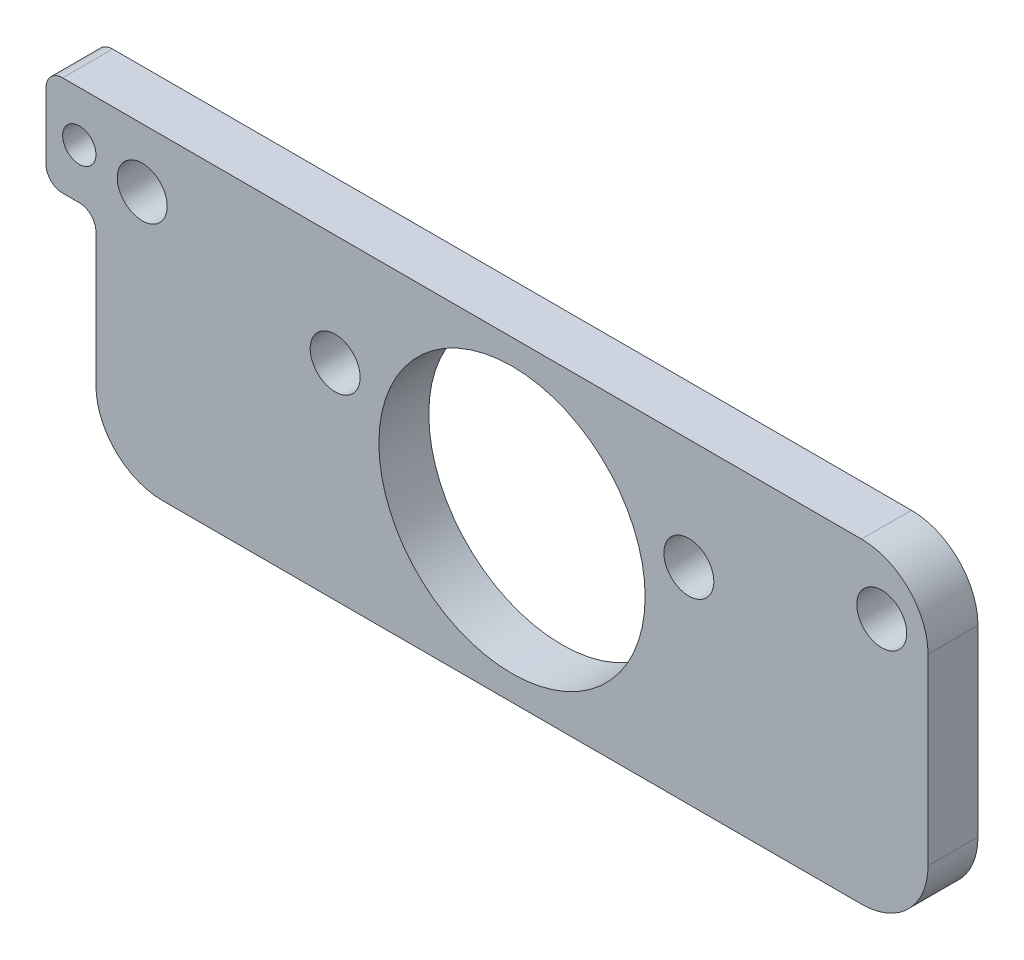
ISO-10303-21;
HEADER;
FILE_DESCRIPTION(('STEP AP214'),'2;1');
FILE_NAME('part.step','',(''),(''),'','','');
FILE_SCHEMA(('AUTOMOTIVE_DESIGN { 1 0 10303 214 1 1 1 1 }'));
ENDSEC;
DATA;
#1=APPLICATION_CONTEXT('core data for automotive mechanical design processes');
#2=APPLICATION_PROTOCOL_DEFINITION('international standard','automotive_design',2000,#1);
#3=PRODUCT_CONTEXT('',#1,'mechanical');
#4=PRODUCT('Part','Part','',(#3));
#5=PRODUCT_RELATED_PRODUCT_CATEGORY('part','',(#4));
#6=PRODUCT_DEFINITION_FORMATION('','',#4);
#7=PRODUCT_DEFINITION_CONTEXT('part definition',#1,'design');
#8=PRODUCT_DEFINITION('design','',#6,#7);
#9=PRODUCT_DEFINITION_SHAPE('','',#8);
#10=(LENGTH_UNIT() NAMED_UNIT(*) SI_UNIT(.MILLI.,.METRE.));
#11=(NAMED_UNIT(*) PLANE_ANGLE_UNIT() SI_UNIT($,.RADIAN.));
#12=(NAMED_UNIT(*) SI_UNIT($,.STERADIAN.) SOLID_ANGLE_UNIT());
#13=UNCERTAINTY_MEASURE_WITH_UNIT(LENGTH_MEASURE(1.E-05),#10,'distance_accuracy_value','');
#14=(GEOMETRIC_REPRESENTATION_CONTEXT(3) GLOBAL_UNCERTAINTY_ASSIGNED_CONTEXT((#13)) GLOBAL_UNIT_ASSIGNED_CONTEXT((#10,
#11,#12)) REPRESENTATION_CONTEXT('',''));
#15=CARTESIAN_POINT('',(0.,0.,0.));
#16=DIRECTION('',(0.,0.,1.));
#17=DIRECTION('',(1.,0.,0.));
#18=AXIS2_PLACEMENT_3D('',#15,#16,#17);
#19=CARTESIAN_POINT('',(-27.0263343656626,1.65967439407026,3.));
#20=DIRECTION('',(0.,0.,1.));
#21=DIRECTION('',(1.,0.,0.));
#22=AXIS2_PLACEMENT_3D('',#19,#20,#21);
#23=PLANE('',#22);
#24=CARTESIAN_POINT('',(21.189959638986,5.11251243142833,3.));
#25=DIRECTION('',(0.,0.,1.));
#26=DIRECTION('',(-1.,0.,0.));
#27=AXIS2_PLACEMENT_3D('',#24,#25,#26);
#28=CIRCLE('',#27,1.5);
#29=CARTESIAN_POINT('',(19.689959638986,5.11251243142833,3.));
#30=VERTEX_POINT('',#29);
#31=EDGE_CURVE('E298',#30,#30,#28,.T.);
#32=ORIENTED_EDGE('',*,*,#31,.F.);
#33=EDGE_LOOP('',(#32));
#34=FACE_BOUND('',#33,.T.);
#35=CARTESIAN_POINT('',(-11.6515184548423,2.00668389019803,3.));
#36=DIRECTION('',(0.,0.,1.));
#37=DIRECTION('',(1.,0.,0.));
#38=AXIS2_PLACEMENT_3D('',#35,#36,#37);
#39=CIRCLE('',#38,1.5);
#40=CARTESIAN_POINT('',(-10.1515184548423,2.00668389019803,3.));
#41=VERTEX_POINT('',#40);
#42=EDGE_CURVE('E310',#41,#41,#39,.T.);
#43=ORIENTED_EDGE('',*,*,#42,.F.);
#44=EDGE_LOOP('',(#43));
#45=FACE_BOUND('',#44,.T.);
#46=CARTESIAN_POINT('',(-1.02633436566255,-0.840325605929738,3.));
#47=DIRECTION('',(0.,0.,1.));
#48=DIRECTION('',(1.,0.,0.));
#49=AXIS2_PLACEMENT_3D('',#46,#47,#48);
#50=CIRCLE('',#49,8.);
#51=CARTESIAN_POINT('',(6.97366563433745,-0.840325605929738,3.));
#52=VERTEX_POINT('',#51);
#53=EDGE_CURVE('E157',#52,#52,#50,.T.);
#54=ORIENTED_EDGE('',*,*,#53,.F.);
#55=EDGE_LOOP('',(#54));
#56=FACE_BOUND('',#55,.T.);
#57=CARTESIAN_POINT('',(-27.0263343656626,1.65967439407026,3.));
#58=DIRECTION('',(0.,0.,-1.));
#59=DIRECTION('',(1.,0.,0.));
#60=AXIS2_PLACEMENT_3D('',#57,#58,#59);
#61=CIRCLE('',#60,0.999999999999999);
#62=CARTESIAN_POINT('',(-27.0263343656626,2.65967439407027,3.));
#63=VERTEX_POINT('',#62);
#64=CARTESIAN_POINT('',(-26.0263343656626,1.65967439407026,3.));
#65=VERTEX_POINT('',#64);
#66=EDGE_CURVE('E177',#63,#65,#61,.T.);
#67=ORIENTED_EDGE('',*,*,#66,.T.);
#68=DIRECTION('',(0.,-1.,0.));
#69=VECTOR('',#68,1.);
#70=CARTESIAN_POINT('',(-26.0263343656626,-6.34032560592973,3.));
#71=LINE('',#70,#69);
#72=CARTESIAN_POINT('',(-26.0263343656626,-6.34032560592973,3.));
#73=VERTEX_POINT('',#72);
#74=EDGE_CURVE('E104',#65,#73,#71,.T.);
#75=ORIENTED_EDGE('',*,*,#74,.T.);
#76=CARTESIAN_POINT('',(-22.0263343656626,-6.34032560592973,3.));
#77=DIRECTION('',(0.,0.,1.));
#78=DIRECTION('',(-1.,0.,0.));
#79=AXIS2_PLACEMENT_3D('',#76,#77,#78);
#80=CIRCLE('',#79,4.);
#81=CARTESIAN_POINT('',(-22.0263343656626,-10.3403256059297,3.));
#82=VERTEX_POINT('',#81);
#83=EDGE_CURVE('E204',#73,#82,#80,.T.);
#84=ORIENTED_EDGE('',*,*,#83,.T.);
#85=DIRECTION('',(1.,0.,0.));
#86=VECTOR('',#85,1.);
#87=CARTESIAN_POINT('',(-22.0263343656626,-10.3403256059297,3.));
#88=LINE('',#87,#86);
#89=CARTESIAN_POINT('',(19.9736656343374,-10.3403256059297,3.));
#90=VERTEX_POINT('',#89);
#91=EDGE_CURVE('E223',#82,#90,#88,.T.);
#92=ORIENTED_EDGE('',*,*,#91,.T.);
#93=CARTESIAN_POINT('',(19.9736656343374,-6.34032560592973,3.));
#94=DIRECTION('',(0.,0.,1.));
#95=DIRECTION('',(1.,0.,0.));
#96=AXIS2_PLACEMENT_3D('',#93,#94,#95);
#97=CIRCLE('',#96,4.);
#98=CARTESIAN_POINT('',(23.9736656343375,-6.34032560592973,3.));
#99=VERTEX_POINT('',#98);
#100=EDGE_CURVE('E220',#90,#99,#97,.T.);
#101=ORIENTED_EDGE('',*,*,#100,.T.);
#102=DIRECTION('',(0.,1.,0.));
#103=VECTOR('',#102,1.);
#104=CARTESIAN_POINT('',(23.9736656343375,4.65967439407026,3.));
#105=LINE('',#104,#103);
#106=CARTESIAN_POINT('',(23.9736656343375,4.65967439407026,3.));
#107=VERTEX_POINT('',#106);
#108=EDGE_CURVE('E222',#99,#107,#105,.T.);
#109=ORIENTED_EDGE('',*,*,#108,.T.);
#110=CARTESIAN_POINT('',(19.9736656343374,4.65967439407026,3.));
#111=DIRECTION('',(0.,0.,1.));
#112=DIRECTION('',(-1.,0.,0.));
#113=AXIS2_PLACEMENT_3D('',#110,#111,#112);
#114=CIRCLE('',#113,4.);
#115=CARTESIAN_POINT('',(19.9736656343374,8.65967439407026,3.));
#116=VERTEX_POINT('',#115);
#117=EDGE_CURVE('E225',#107,#116,#114,.T.);
#118=ORIENTED_EDGE('',*,*,#117,.T.);
#119=DIRECTION('',(-1.,0.,0.));
#120=VECTOR('',#119,1.);
#121=CARTESIAN_POINT('',(-22.0263343656625,8.65967439407026,3.));
#122=LINE('',#121,#120);
#123=CARTESIAN_POINT('',(-28.0263343656625,8.65967439407027,3.));
#124=VERTEX_POINT('',#123);
#125=EDGE_CURVE('E231',#116,#124,#122,.T.);
#126=ORIENTED_EDGE('',*,*,#125,.T.);
#127=CARTESIAN_POINT('',(-28.0263343656625,7.65967439407026,3.));
#128=DIRECTION('',(0.,0.,1.));
#129=DIRECTION('',(1.,0.,0.));
#130=AXIS2_PLACEMENT_3D('',#127,#128,#129);
#131=CIRCLE('',#130,1.);
#132=CARTESIAN_POINT('',(-29.0263343656625,7.65967439407026,3.));
#133=VERTEX_POINT('',#132);
#134=EDGE_CURVE('E135',#124,#133,#131,.T.);
#135=ORIENTED_EDGE('',*,*,#134,.T.);
#136=DIRECTION('',(0.,-1.,0.));
#137=VECTOR('',#136,1.);
#138=CARTESIAN_POINT('',(-29.0263343656625,7.65967439407026,3.));
#139=LINE('',#138,#137);
#140=CARTESIAN_POINT('',(-29.0263343656625,3.65967439407027,3.));
#141=VERTEX_POINT('',#140);
#142=EDGE_CURVE('E129',#133,#141,#139,.T.);
#143=ORIENTED_EDGE('',*,*,#142,.T.);
#144=CARTESIAN_POINT('',(-28.0263343656625,3.65967439407027,3.));
#145=DIRECTION('',(0.,0.,1.));
#146=DIRECTION('',(1.,0.,0.));
#147=AXIS2_PLACEMENT_3D('',#144,#145,#146);
#148=CIRCLE('',#147,1.);
#149=CARTESIAN_POINT('',(-28.0263343656625,2.65967439407026,3.));
#150=VERTEX_POINT('',#149);
#151=EDGE_CURVE('E133',#141,#150,#148,.T.);
#152=ORIENTED_EDGE('',*,*,#151,.T.);
#153=DIRECTION('',(1.,0.,0.));
#154=VECTOR('',#153,1.);
#155=CARTESIAN_POINT('',(-28.0263343656625,2.65967439407027,3.));
#156=LINE('',#155,#154);
#157=EDGE_CURVE('E49',#150,#63,#156,.T.);
#158=ORIENTED_EDGE('',*,*,#157,.T.);
#159=EDGE_LOOP('',(#67,#75,#84,#92,#101,#109,#118,#126,#135,#143,#152,#158));
#160=FACE_BOUND('',#159,.T.);
#161=CARTESIAN_POINT('',(-23.2426283703111,5.11251243142833,3.));
#162=DIRECTION('',(0.,0.,1.));
#163=DIRECTION('',(1.,0.,0.));
#164=AXIS2_PLACEMENT_3D('',#161,#162,#163);
#165=CIRCLE('',#164,1.5);
#166=CARTESIAN_POINT('',(-21.7426283703111,5.11251243142833,3.));
#167=VERTEX_POINT('',#166);
#168=EDGE_CURVE('E316',#167,#167,#165,.T.);
#169=ORIENTED_EDGE('',*,*,#168,.F.);
#170=EDGE_LOOP('',(#169));
#171=FACE_BOUND('',#170,.T.);
#172=CARTESIAN_POINT('',(9.59884972351719,2.00668389019803,3.));
#173=DIRECTION('',(0.,0.,1.));
#174=DIRECTION('',(-1.,0.,0.));
#175=AXIS2_PLACEMENT_3D('',#172,#173,#174);
#176=CIRCLE('',#175,1.5);
#177=CARTESIAN_POINT('',(8.09884972351719,2.00668389019803,3.));
#178=VERTEX_POINT('',#177);
#179=EDGE_CURVE('E304',#178,#178,#176,.T.);
#180=ORIENTED_EDGE('',*,*,#179,.F.);
#181=EDGE_LOOP('',(#180));
#182=FACE_BOUND('',#181,.T.);
#183=CARTESIAN_POINT('',(-27.0263343656625,5.65967439407026,3.));
#184=DIRECTION('',(0.,0.,1.));
#185=DIRECTION('',(1.,0.,0.));
#186=AXIS2_PLACEMENT_3D('',#183,#184,#185);
#187=CIRCLE('',#186,1.);
#188=CARTESIAN_POINT('',(-26.0263343656625,5.65967439407026,3.));
#189=VERTEX_POINT('',#188);
#190=EDGE_CURVE('E289',#189,#189,#187,.T.);
#191=ORIENTED_EDGE('',*,*,#190,.F.);
#192=EDGE_LOOP('',(#191));
#193=FACE_BOUND('',#192,.T.);
#194=ADVANCED_FACE('F32',(#34,#45,#56,#160,#171,#182,#193),#23,.T.);
#195=CARTESIAN_POINT('',(-27.0263343656626,1.65967439407026,0.));
#196=DIRECTION('',(0.,0.,1.));
#197=DIRECTION('',(1.,0.,0.));
#198=AXIS2_PLACEMENT_3D('',#195,#196,#197);
#199=PLANE('',#198);
#200=CARTESIAN_POINT('',(-27.0263343656626,1.65967439407026,0.));
#201=DIRECTION('',(0.,0.,-1.));
#202=DIRECTION('',(1.,0.,0.));
#203=AXIS2_PLACEMENT_3D('',#200,#201,#202);
#204=CIRCLE('',#203,0.999999999999999);
#205=CARTESIAN_POINT('',(-27.0263343656626,2.65967439407027,0.));
#206=VERTEX_POINT('',#205);
#207=CARTESIAN_POINT('',(-26.0263343656626,1.65967439407026,0.));
#208=VERTEX_POINT('',#207);
#209=EDGE_CURVE('E153',#206,#208,#204,.T.);
#210=ORIENTED_EDGE('',*,*,#209,.F.);
#211=DIRECTION('',(1.,0.,0.));
#212=VECTOR('',#211,1.);
#213=CARTESIAN_POINT('',(-28.0263343656625,2.65967439407027,0.));
#214=LINE('',#213,#212);
#215=CARTESIAN_POINT('',(-28.0263343656625,2.65967439407026,0.));
#216=VERTEX_POINT('',#215);
#217=EDGE_CURVE('E96',#216,#206,#214,.T.);
#218=ORIENTED_EDGE('',*,*,#217,.F.);
#219=CARTESIAN_POINT('',(-28.0263343656625,3.65967439407027,0.));
#220=DIRECTION('',(0.,0.,1.));
#221=DIRECTION('',(1.,0.,0.));
#222=AXIS2_PLACEMENT_3D('',#219,#220,#221);
#223=CIRCLE('',#222,1.);
#224=CARTESIAN_POINT('',(-29.0263343656625,3.65967439407027,0.));
#225=VERTEX_POINT('',#224);
#226=EDGE_CURVE('E90',#225,#216,#223,.T.);
#227=ORIENTED_EDGE('',*,*,#226,.F.);
#228=DIRECTION('',(0.,-1.,0.));
#229=VECTOR('',#228,1.);
#230=CARTESIAN_POINT('',(-29.0263343656625,7.65967439407026,0.));
#231=LINE('',#230,#229);
#232=CARTESIAN_POINT('',(-29.0263343656625,7.65967439407026,0.));
#233=VERTEX_POINT('',#232);
#234=EDGE_CURVE('E143',#233,#225,#231,.T.);
#235=ORIENTED_EDGE('',*,*,#234,.F.);
#236=CARTESIAN_POINT('',(-28.0263343656625,7.65967439407026,0.));
#237=DIRECTION('',(0.,0.,1.));
#238=DIRECTION('',(1.,0.,0.));
#239=AXIS2_PLACEMENT_3D('',#236,#237,#238);
#240=CIRCLE('',#239,1.);
#241=CARTESIAN_POINT('',(-28.0263343656625,8.65967439407027,0.));
#242=VERTEX_POINT('',#241);
#243=EDGE_CURVE('E172',#242,#233,#240,.T.);
#244=ORIENTED_EDGE('',*,*,#243,.F.);
#245=DIRECTION('',(-1.,0.,0.));
#246=VECTOR('',#245,1.);
#247=CARTESIAN_POINT('',(-22.0263343656625,8.65967439407026,0.));
#248=LINE('',#247,#246);
#249=CARTESIAN_POINT('',(19.9736656343374,8.65967439407026,0.));
#250=VERTEX_POINT('',#249);
#251=EDGE_CURVE('E170',#250,#242,#248,.T.);
#252=ORIENTED_EDGE('',*,*,#251,.F.);
#253=CARTESIAN_POINT('',(19.9736656343374,4.65967439407026,0.));
#254=DIRECTION('',(0.,0.,1.));
#255=DIRECTION('',(-1.,0.,0.));
#256=AXIS2_PLACEMENT_3D('',#253,#254,#255);
#257=CIRCLE('',#256,4.);
#258=CARTESIAN_POINT('',(23.9736656343375,4.65967439407026,0.));
#259=VERTEX_POINT('',#258);
#260=EDGE_CURVE('E167',#259,#250,#257,.T.);
#261=ORIENTED_EDGE('',*,*,#260,.F.);
#262=DIRECTION('',(0.,1.,0.));
#263=VECTOR('',#262,1.);
#264=CARTESIAN_POINT('',(23.9736656343375,4.65967439407026,0.));
#265=LINE('',#264,#263);
#266=CARTESIAN_POINT('',(23.9736656343375,-6.34032560592973,0.));
#267=VERTEX_POINT('',#266);
#268=EDGE_CURVE('E165',#267,#259,#265,.T.);
#269=ORIENTED_EDGE('',*,*,#268,.F.);
#270=CARTESIAN_POINT('',(19.9736656343374,-6.34032560592973,0.));
#271=DIRECTION('',(0.,0.,1.));
#272=DIRECTION('',(1.,0.,0.));
#273=AXIS2_PLACEMENT_3D('',#270,#271,#272);
#274=CIRCLE('',#273,4.);
#275=CARTESIAN_POINT('',(19.9736656343374,-10.3403256059297,0.));
#276=VERTEX_POINT('',#275);
#277=EDGE_CURVE('E163',#276,#267,#274,.T.);
#278=ORIENTED_EDGE('',*,*,#277,.F.);
#279=DIRECTION('',(1.,0.,0.));
#280=VECTOR('',#279,1.);
#281=CARTESIAN_POINT('',(-22.0263343656626,-10.3403256059297,0.));
#282=LINE('',#281,#280);
#283=CARTESIAN_POINT('',(-22.0263343656626,-10.3403256059297,0.));
#284=VERTEX_POINT('',#283);
#285=EDGE_CURVE('E161',#284,#276,#282,.T.);
#286=ORIENTED_EDGE('',*,*,#285,.F.);
#287=CARTESIAN_POINT('',(-22.0263343656626,-6.34032560592973,0.));
#288=DIRECTION('',(0.,0.,1.));
#289=DIRECTION('',(-1.,0.,0.));
#290=AXIS2_PLACEMENT_3D('',#287,#288,#289);
#291=CIRCLE('',#290,4.);
#292=CARTESIAN_POINT('',(-26.0263343656626,-6.34032560592973,0.));
#293=VERTEX_POINT('',#292);
#294=EDGE_CURVE('E159',#293,#284,#291,.T.);
#295=ORIENTED_EDGE('',*,*,#294,.F.);
#296=DIRECTION('',(0.,-1.,0.));
#297=VECTOR('',#296,1.);
#298=CARTESIAN_POINT('',(-26.0263343656626,-6.34032560592973,0.));
#299=LINE('',#298,#297);
#300=EDGE_CURVE('E156',#208,#293,#299,.T.);
#301=ORIENTED_EDGE('',*,*,#300,.F.);
#302=EDGE_LOOP('',(#210,#218,#227,#235,#244,#252,#261,#269,#278,#286,#295,#301));
#303=FACE_BOUND('',#302,.T.);
#304=CARTESIAN_POINT('',(-1.02633436566255,-0.840325605929738,0.));
#305=DIRECTION('',(0.,0.,1.));
#306=DIRECTION('',(1.,0.,0.));
#307=AXIS2_PLACEMENT_3D('',#304,#305,#306);
#308=CIRCLE('',#307,8.);
#309=CARTESIAN_POINT('',(6.97366563433745,-0.840325605929738,0.));
#310=VERTEX_POINT('',#309);
#311=EDGE_CURVE('E319',#310,#310,#308,.T.);
#312=ORIENTED_EDGE('',*,*,#311,.T.);
#313=EDGE_LOOP('',(#312));
#314=FACE_BOUND('',#313,.T.);
#315=CARTESIAN_POINT('',(-23.2426283703111,5.11251243142833,0.));
#316=DIRECTION('',(0.,0.,1.));
#317=DIRECTION('',(1.,0.,0.));
#318=AXIS2_PLACEMENT_3D('',#315,#316,#317);
#319=CIRCLE('',#318,1.5);
#320=CARTESIAN_POINT('',(-21.7426283703111,5.11251243142833,0.));
#321=VERTEX_POINT('',#320);
#322=EDGE_CURVE('E313',#321,#321,#319,.T.);
#323=ORIENTED_EDGE('',*,*,#322,.T.);
#324=EDGE_LOOP('',(#323));
#325=FACE_BOUND('',#324,.T.);
#326=CARTESIAN_POINT('',(-11.6515184548423,2.00668389019803,0.));
#327=DIRECTION('',(0.,0.,1.));
#328=DIRECTION('',(1.,0.,0.));
#329=AXIS2_PLACEMENT_3D('',#326,#327,#328);
#330=CIRCLE('',#329,1.5);
#331=CARTESIAN_POINT('',(-10.1515184548423,2.00668389019803,0.));
#332=VERTEX_POINT('',#331);
#333=EDGE_CURVE('E307',#332,#332,#330,.T.);
#334=ORIENTED_EDGE('',*,*,#333,.T.);
#335=EDGE_LOOP('',(#334));
#336=FACE_BOUND('',#335,.T.);
#337=CARTESIAN_POINT('',(9.59884972351719,2.00668389019803,0.));
#338=DIRECTION('',(0.,0.,1.));
#339=DIRECTION('',(-1.,0.,0.));
#340=AXIS2_PLACEMENT_3D('',#337,#338,#339);
#341=CIRCLE('',#340,1.5);
#342=CARTESIAN_POINT('',(8.09884972351719,2.00668389019803,0.));
#343=VERTEX_POINT('',#342);
#344=EDGE_CURVE('E301',#343,#343,#341,.T.);
#345=ORIENTED_EDGE('',*,*,#344,.T.);
#346=EDGE_LOOP('',(#345));
#347=FACE_BOUND('',#346,.T.);
#348=CARTESIAN_POINT('',(21.189959638986,5.11251243142833,0.));
#349=DIRECTION('',(0.,0.,1.));
#350=DIRECTION('',(-1.,0.,0.));
#351=AXIS2_PLACEMENT_3D('',#348,#349,#350);
#352=CIRCLE('',#351,1.5);
#353=CARTESIAN_POINT('',(19.689959638986,5.11251243142833,0.));
#354=VERTEX_POINT('',#353);
#355=EDGE_CURVE('E295',#354,#354,#352,.T.);
#356=ORIENTED_EDGE('',*,*,#355,.T.);
#357=EDGE_LOOP('',(#356));
#358=FACE_BOUND('',#357,.T.);
#359=CARTESIAN_POINT('',(-27.0263343656625,5.65967439407026,0.));
#360=DIRECTION('',(0.,0.,1.));
#361=DIRECTION('',(1.,0.,0.));
#362=AXIS2_PLACEMENT_3D('',#359,#360,#361);
#363=CIRCLE('',#362,1.);
#364=CARTESIAN_POINT('',(-26.0263343656625,5.65967439407026,0.));
#365=VERTEX_POINT('',#364);
#366=EDGE_CURVE('E292',#365,#365,#363,.T.);
#367=ORIENTED_EDGE('',*,*,#366,.T.);
#368=EDGE_LOOP('',(#367));
#369=FACE_BOUND('',#368,.T.);
#370=ADVANCED_FACE('F208',(#303,#314,#325,#336,#347,#358,#369),#199,.F.);
#371=CARTESIAN_POINT('',(-27.0263343656626,1.65967439407026,3.));
#372=DIRECTION('',(0.,0.,-1.));
#373=DIRECTION('',(-1.,0.,0.));
#374=AXIS2_PLACEMENT_3D('',#371,#372,#373);
#375=CYLINDRICAL_SURFACE('',#374,0.999999999999999);
#376=ORIENTED_EDGE('',*,*,#209,.T.);
#377=DIRECTION('',(0.,0.,-1.));
#378=VECTOR('',#377,1.);
#379=CARTESIAN_POINT('',(-26.0263343656626,1.65967439407026,3.));
#380=LINE('',#379,#378);
#381=EDGE_CURVE('E11',#65,#208,#380,.T.);
#382=ORIENTED_EDGE('',*,*,#381,.F.);
#383=ORIENTED_EDGE('',*,*,#66,.F.);
#384=DIRECTION('',(0.,0.,-1.));
#385=VECTOR('',#384,1.);
#386=CARTESIAN_POINT('',(-27.0263343656626,2.65967439407027,3.));
#387=LINE('',#386,#385);
#388=EDGE_CURVE('E149',#63,#206,#387,.T.);
#389=ORIENTED_EDGE('',*,*,#388,.T.);
#390=EDGE_LOOP('',(#376,#382,#383,#389));
#391=FACE_BOUND('',#390,.T.);
#392=ADVANCED_FACE('F34',(#391),#375,.F.);
#393=CARTESIAN_POINT('',(-26.0263343656626,-6.34032560592973,3.));
#394=DIRECTION('',(1.,0.,0.));
#395=DIRECTION('',(0.,1.,0.));
#396=AXIS2_PLACEMENT_3D('',#393,#394,#395);
#397=PLANE('',#396);
#398=ORIENTED_EDGE('',*,*,#300,.T.);
#399=DIRECTION('',(0.,0.,-1.));
#400=VECTOR('',#399,1.);
#401=CARTESIAN_POINT('',(-26.0263343656626,-6.34032560592973,3.));
#402=LINE('',#401,#400);
#403=EDGE_CURVE('E41',#73,#293,#402,.T.);
#404=ORIENTED_EDGE('',*,*,#403,.F.);
#405=ORIENTED_EDGE('',*,*,#74,.F.);
#406=ORIENTED_EDGE('',*,*,#381,.T.);
#407=EDGE_LOOP('',(#398,#404,#405,#406));
#408=FACE_BOUND('',#407,.T.);
#409=ADVANCED_FACE('F448',(#408),#397,.F.);
#410=CARTESIAN_POINT('',(-22.0263343656626,-6.34032560592973,3.));
#411=DIRECTION('',(0.,0.,-1.));
#412=DIRECTION('',(-1.,0.,0.));
#413=AXIS2_PLACEMENT_3D('',#410,#411,#412);
#414=CYLINDRICAL_SURFACE('',#413,4.);
#415=ORIENTED_EDGE('',*,*,#294,.T.);
#416=DIRECTION('',(0.,0.,-1.));
#417=VECTOR('',#416,1.);
#418=CARTESIAN_POINT('',(-22.0263343656626,-10.3403256059297,3.));
#419=LINE('',#418,#417);
#420=EDGE_CURVE('E196',#82,#284,#419,.T.);
#421=ORIENTED_EDGE('',*,*,#420,.F.);
#422=ORIENTED_EDGE('',*,*,#83,.F.);
#423=ORIENTED_EDGE('',*,*,#403,.T.);
#424=EDGE_LOOP('',(#415,#421,#422,#423));
#425=FACE_BOUND('',#424,.T.);
#426=ADVANCED_FACE('F202',(#425),#414,.T.);
#427=CARTESIAN_POINT('',(-22.0263343656626,-10.3403256059297,3.));
#428=DIRECTION('',(0.,1.,0.));
#429=DIRECTION('',(0.,0.,1.));
#430=AXIS2_PLACEMENT_3D('',#427,#428,#429);
#431=PLANE('',#430);
#432=ORIENTED_EDGE('',*,*,#285,.T.);
#433=DIRECTION('',(0.,0.,-1.));
#434=VECTOR('',#433,1.);
#435=CARTESIAN_POINT('',(19.9736656343374,-10.3403256059297,3.));
#436=LINE('',#435,#434);
#437=EDGE_CURVE('E193',#90,#276,#436,.T.);
#438=ORIENTED_EDGE('',*,*,#437,.F.);
#439=ORIENTED_EDGE('',*,*,#91,.F.);
#440=ORIENTED_EDGE('',*,*,#420,.T.);
#441=EDGE_LOOP('',(#432,#438,#439,#440));
#442=FACE_BOUND('',#441,.T.);
#443=ADVANCED_FACE('F214',(#442),#431,.F.);
#444=CARTESIAN_POINT('',(19.9736656343374,-6.34032560592973,3.));
#445=DIRECTION('',(0.,0.,-1.));
#446=DIRECTION('',(-1.,0.,0.));
#447=AXIS2_PLACEMENT_3D('',#444,#445,#446);
#448=CYLINDRICAL_SURFACE('',#447,4.);
#449=ORIENTED_EDGE('',*,*,#277,.T.);
#450=DIRECTION('',(0.,0.,-1.));
#451=VECTOR('',#450,1.);
#452=CARTESIAN_POINT('',(23.9736656343375,-6.34032560592973,3.));
#453=LINE('',#452,#451);
#454=EDGE_CURVE('E190',#99,#267,#453,.T.);
#455=ORIENTED_EDGE('',*,*,#454,.F.);
#456=ORIENTED_EDGE('',*,*,#100,.F.);
#457=ORIENTED_EDGE('',*,*,#437,.T.);
#458=EDGE_LOOP('',(#449,#455,#456,#457));
#459=FACE_BOUND('',#458,.T.);
#460=ADVANCED_FACE('F218',(#459),#448,.T.);
#461=CARTESIAN_POINT('',(23.9736656343375,4.65967439407026,3.));
#462=DIRECTION('',(-1.,0.,0.));
#463=DIRECTION('',(0.,-1.,0.));
#464=AXIS2_PLACEMENT_3D('',#461,#462,#463);
#465=PLANE('',#464);
#466=ORIENTED_EDGE('',*,*,#268,.T.);
#467=DIRECTION('',(0.,0.,-1.));
#468=VECTOR('',#467,1.);
#469=CARTESIAN_POINT('',(23.9736656343375,4.65967439407026,3.));
#470=LINE('',#469,#468);
#471=EDGE_CURVE('E187',#107,#259,#470,.T.);
#472=ORIENTED_EDGE('',*,*,#471,.F.);
#473=ORIENTED_EDGE('',*,*,#108,.F.);
#474=ORIENTED_EDGE('',*,*,#454,.T.);
#475=EDGE_LOOP('',(#466,#472,#473,#474));
#476=FACE_BOUND('',#475,.T.);
#477=ADVANCED_FACE('F413',(#476),#465,.F.);
#478=CARTESIAN_POINT('',(19.9736656343374,4.65967439407026,3.));
#479=DIRECTION('',(0.,0.,-1.));
#480=DIRECTION('',(-1.,0.,0.));
#481=AXIS2_PLACEMENT_3D('',#478,#479,#480);
#482=CYLINDRICAL_SURFACE('',#481,4.);
#483=ORIENTED_EDGE('',*,*,#260,.T.);
#484=DIRECTION('',(0.,0.,-1.));
#485=VECTOR('',#484,1.);
#486=CARTESIAN_POINT('',(19.9736656343374,8.65967439407026,3.));
#487=LINE('',#486,#485);
#488=EDGE_CURVE('E184',#116,#250,#487,.T.);
#489=ORIENTED_EDGE('',*,*,#488,.F.);
#490=ORIENTED_EDGE('',*,*,#117,.F.);
#491=ORIENTED_EDGE('',*,*,#471,.T.);
#492=EDGE_LOOP('',(#483,#489,#490,#491));
#493=FACE_BOUND('',#492,.T.);
#494=ADVANCED_FACE('F403',(#493),#482,.T.);
#495=CARTESIAN_POINT('',(-22.0263343656625,8.65967439407026,3.));
#496=DIRECTION('',(0.,-1.,0.));
#497=DIRECTION('',(1.,0.,0.));
#498=AXIS2_PLACEMENT_3D('',#495,#496,#497);
#499=PLANE('',#498);
#500=ORIENTED_EDGE('',*,*,#251,.T.);
#501=DIRECTION('',(0.,0.,-1.));
#502=VECTOR('',#501,1.);
#503=CARTESIAN_POINT('',(-28.0263343656625,8.65967439407027,3.));
#504=LINE('',#503,#502);
#505=EDGE_CURVE('E181',#124,#242,#504,.T.);
#506=ORIENTED_EDGE('',*,*,#505,.F.);
#507=ORIENTED_EDGE('',*,*,#125,.F.);
#508=ORIENTED_EDGE('',*,*,#488,.T.);
#509=EDGE_LOOP('',(#500,#506,#507,#508));
#510=FACE_BOUND('',#509,.T.);
#511=ADVANCED_FACE('F237',(#510),#499,.F.);
#512=CARTESIAN_POINT('',(-28.0263343656625,7.65967439407026,3.));
#513=DIRECTION('',(0.,0.,-1.));
#514=DIRECTION('',(-1.,0.,0.));
#515=AXIS2_PLACEMENT_3D('',#512,#513,#514);
#516=CYLINDRICAL_SURFACE('',#515,1.);
#517=ORIENTED_EDGE('',*,*,#243,.T.);
#518=DIRECTION('',(0.,0.,-1.));
#519=VECTOR('',#518,1.);
#520=CARTESIAN_POINT('',(-29.0263343656625,7.65967439407026,3.));
#521=LINE('',#520,#519);
#522=EDGE_CURVE('E144',#133,#233,#521,.T.);
#523=ORIENTED_EDGE('',*,*,#522,.F.);
#524=ORIENTED_EDGE('',*,*,#134,.F.);
#525=ORIENTED_EDGE('',*,*,#505,.T.);
#526=EDGE_LOOP('',(#517,#523,#524,#525));
#527=FACE_BOUND('',#526,.T.);
#528=ADVANCED_FACE('F240',(#527),#516,.T.);
#529=CARTESIAN_POINT('',(-29.0263343656625,7.65967439407026,3.));
#530=DIRECTION('',(1.,0.,0.));
#531=DIRECTION('',(0.,0.,-1.));
#532=AXIS2_PLACEMENT_3D('',#529,#530,#531);
#533=PLANE('',#532);
#534=ORIENTED_EDGE('',*,*,#234,.T.);
#535=DIRECTION('',(0.,0.,-1.));
#536=VECTOR('',#535,1.);
#537=CARTESIAN_POINT('',(-29.0263343656625,3.65967439407027,3.));
#538=LINE('',#537,#536);
#539=EDGE_CURVE('E140',#141,#225,#538,.T.);
#540=ORIENTED_EDGE('',*,*,#539,.F.);
#541=ORIENTED_EDGE('',*,*,#142,.F.);
#542=ORIENTED_EDGE('',*,*,#522,.T.);
#543=EDGE_LOOP('',(#534,#540,#541,#542));
#544=FACE_BOUND('',#543,.T.);
#545=ADVANCED_FACE('F141',(#544),#533,.F.);
#546=CARTESIAN_POINT('',(-28.0263343656625,3.65967439407027,3.));
#547=DIRECTION('',(0.,0.,-1.));
#548=DIRECTION('',(-1.,0.,0.));
#549=AXIS2_PLACEMENT_3D('',#546,#547,#548);
#550=CYLINDRICAL_SURFACE('',#549,1.);
#551=ORIENTED_EDGE('',*,*,#226,.T.);
#552=DIRECTION('',(0.,0.,-1.));
#553=VECTOR('',#552,1.);
#554=CARTESIAN_POINT('',(-28.0263343656625,2.65967439407026,3.));
#555=LINE('',#554,#553);
#556=EDGE_CURVE('E145',#150,#216,#555,.T.);
#557=ORIENTED_EDGE('',*,*,#556,.F.);
#558=ORIENTED_EDGE('',*,*,#151,.F.);
#559=ORIENTED_EDGE('',*,*,#539,.T.);
#560=EDGE_LOOP('',(#551,#557,#558,#559));
#561=FACE_BOUND('',#560,.T.);
#562=ADVANCED_FACE('F147',(#561),#550,.T.);
#563=CARTESIAN_POINT('',(-28.0263343656625,2.65967439407027,3.));
#564=DIRECTION('',(0.,1.,0.));
#565=DIRECTION('',(0.,0.,1.));
#566=AXIS2_PLACEMENT_3D('',#563,#564,#565);
#567=PLANE('',#566);
#568=ORIENTED_EDGE('',*,*,#217,.T.);
#569=ORIENTED_EDGE('',*,*,#388,.F.);
#570=ORIENTED_EDGE('',*,*,#157,.F.);
#571=ORIENTED_EDGE('',*,*,#556,.T.);
#572=EDGE_LOOP('',(#568,#569,#570,#571));
#573=FACE_BOUND('',#572,.T.);
#574=ADVANCED_FACE('F244',(#573),#567,.F.);
#575=CARTESIAN_POINT('',(-1.02633436566255,-0.840325605929738,3.));
#576=DIRECTION('',(0.,0.,-1.));
#577=DIRECTION('',(-1.,0.,0.));
#578=AXIS2_PLACEMENT_3D('',#575,#576,#577);
#579=CYLINDRICAL_SURFACE('',#578,8.);
#580=ORIENTED_EDGE('',*,*,#53,.T.);
#581=EDGE_LOOP('',(#580));
#582=FACE_BOUND('',#581,.T.);
#583=ORIENTED_EDGE('',*,*,#311,.F.);
#584=EDGE_LOOP('',(#583));
#585=FACE_BOUND('',#584,.T.);
#586=ADVANCED_FACE('F246',(#582,#585),#579,.F.);
#587=CARTESIAN_POINT('',(-23.2426283703111,5.11251243142833,3.));
#588=DIRECTION('',(0.,0.,-1.));
#589=DIRECTION('',(-1.,0.,0.));
#590=AXIS2_PLACEMENT_3D('',#587,#588,#589);
#591=CYLINDRICAL_SURFACE('',#590,1.5);
#592=ORIENTED_EDGE('',*,*,#168,.T.);
#593=EDGE_LOOP('',(#592));
#594=FACE_BOUND('',#593,.T.);
#595=ORIENTED_EDGE('',*,*,#322,.F.);
#596=EDGE_LOOP('',(#595));
#597=FACE_BOUND('',#596,.T.);
#598=ADVANCED_FACE('F252',(#594,#597),#591,.F.);
#599=CARTESIAN_POINT('',(-11.6515184548423,2.00668389019803,3.));
#600=DIRECTION('',(0.,0.,-1.));
#601=DIRECTION('',(-1.,0.,0.));
#602=AXIS2_PLACEMENT_3D('',#599,#600,#601);
#603=CYLINDRICAL_SURFACE('',#602,1.5);
#604=ORIENTED_EDGE('',*,*,#42,.T.);
#605=EDGE_LOOP('',(#604));
#606=FACE_BOUND('',#605,.T.);
#607=ORIENTED_EDGE('',*,*,#333,.F.);
#608=EDGE_LOOP('',(#607));
#609=FACE_BOUND('',#608,.T.);
#610=ADVANCED_FACE('F268',(#606,#609),#603,.F.);
#611=CARTESIAN_POINT('',(9.59884972351719,2.00668389019803,3.));
#612=DIRECTION('',(0.,0.,-1.));
#613=DIRECTION('',(-1.,0.,0.));
#614=AXIS2_PLACEMENT_3D('',#611,#612,#613);
#615=CYLINDRICAL_SURFACE('',#614,1.5);
#616=ORIENTED_EDGE('',*,*,#179,.T.);
#617=EDGE_LOOP('',(#616));
#618=FACE_BOUND('',#617,.T.);
#619=ORIENTED_EDGE('',*,*,#344,.F.);
#620=EDGE_LOOP('',(#619));
#621=FACE_BOUND('',#620,.T.);
#622=ADVANCED_FACE('F272',(#618,#621),#615,.F.);
#623=CARTESIAN_POINT('',(21.189959638986,5.11251243142833,3.));
#624=DIRECTION('',(0.,0.,-1.));
#625=DIRECTION('',(-1.,0.,0.));
#626=AXIS2_PLACEMENT_3D('',#623,#624,#625);
#627=CYLINDRICAL_SURFACE('',#626,1.5);
#628=ORIENTED_EDGE('',*,*,#31,.T.);
#629=EDGE_LOOP('',(#628));
#630=FACE_BOUND('',#629,.T.);
#631=ORIENTED_EDGE('',*,*,#355,.F.);
#632=EDGE_LOOP('',(#631));
#633=FACE_BOUND('',#632,.T.);
#634=ADVANCED_FACE('F276',(#630,#633),#627,.F.);
#635=CARTESIAN_POINT('',(-27.0263343656625,5.65967439407026,3.));
#636=DIRECTION('',(0.,0.,-1.));
#637=DIRECTION('',(-1.,0.,0.));
#638=AXIS2_PLACEMENT_3D('',#635,#636,#637);
#639=CYLINDRICAL_SURFACE('',#638,1.);
#640=ORIENTED_EDGE('',*,*,#190,.T.);
#641=EDGE_LOOP('',(#640));
#642=FACE_BOUND('',#641,.T.);
#643=ORIENTED_EDGE('',*,*,#366,.F.);
#644=EDGE_LOOP('',(#643));
#645=FACE_BOUND('',#644,.T.);
#646=ADVANCED_FACE('F280',(#642,#645),#639,.F.);
#647=CLOSED_SHELL('',(#194,#370,#392,#409,#426,#443,#460,#477,#494,#511,#528,#545,#562,#574,
#586,#598,#610,#622,#634,#646));
#648=MANIFOLD_SOLID_BREP('B2',#647);
#649=ADVANCED_BREP_SHAPE_REPRESENTATION('',(#18,#648),#14);
#650=SHAPE_DEFINITION_REPRESENTATION(#9,#649);
ENDSEC;
END-ISO-10303-21;
